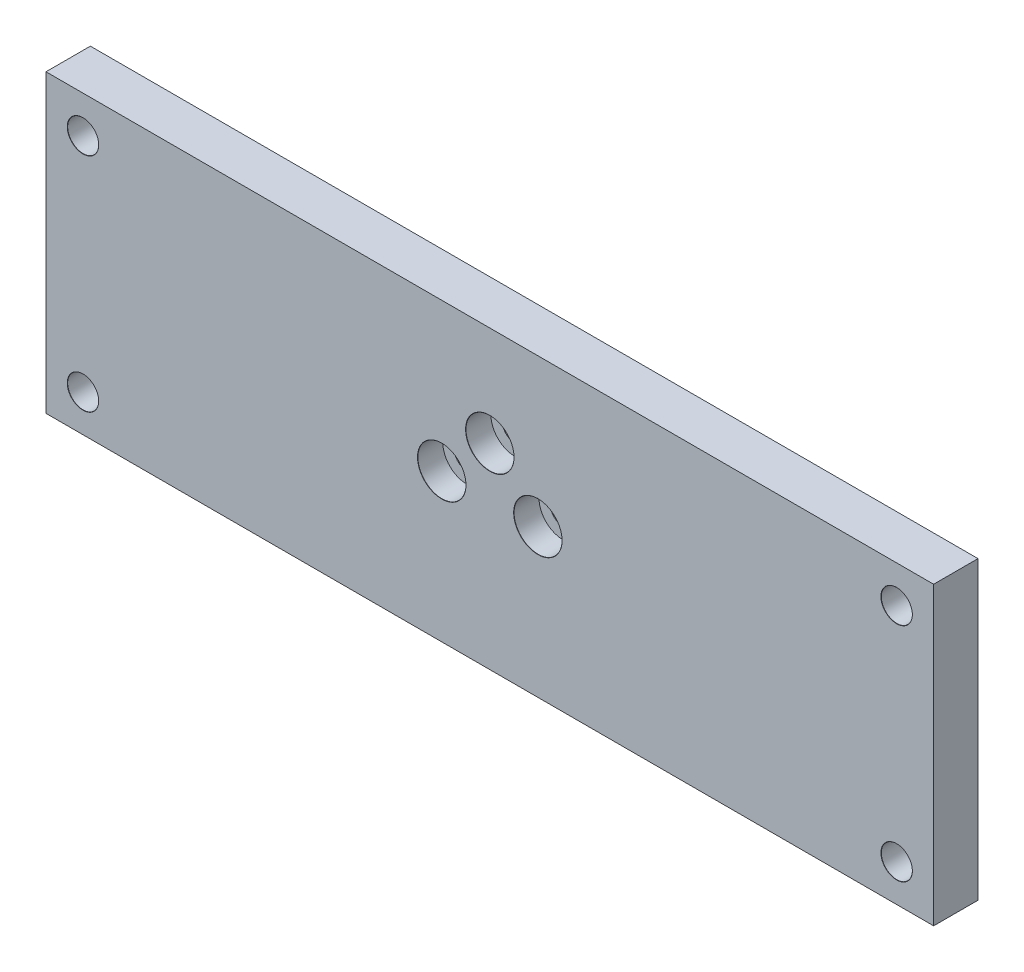
ISO-10303-21;
HEADER;
FILE_DESCRIPTION(('STEP AP214'),'2;1');
FILE_NAME('part.step','',(''),(''),'','','');
FILE_SCHEMA(('AUTOMOTIVE_DESIGN { 1 0 10303 214 1 1 1 1 }'));
ENDSEC;
DATA;
#1=APPLICATION_CONTEXT('core data for automotive mechanical design processes');
#2=APPLICATION_PROTOCOL_DEFINITION('international standard','automotive_design',2000,#1);
#3=PRODUCT_CONTEXT('',#1,'mechanical');
#4=PRODUCT('Part','Part','',(#3));
#5=PRODUCT_RELATED_PRODUCT_CATEGORY('part','',(#4));
#6=PRODUCT_DEFINITION_FORMATION('','',#4);
#7=PRODUCT_DEFINITION_CONTEXT('part definition',#1,'design');
#8=PRODUCT_DEFINITION('design','',#6,#7);
#9=PRODUCT_DEFINITION_SHAPE('','',#8);
#10=(LENGTH_UNIT() NAMED_UNIT(*) SI_UNIT(.MILLI.,.METRE.));
#11=(NAMED_UNIT(*) PLANE_ANGLE_UNIT() SI_UNIT($,.RADIAN.));
#12=(NAMED_UNIT(*) SI_UNIT($,.STERADIAN.) SOLID_ANGLE_UNIT());
#13=UNCERTAINTY_MEASURE_WITH_UNIT(LENGTH_MEASURE(1.E-05),#10,'distance_accuracy_value','');
#14=(GEOMETRIC_REPRESENTATION_CONTEXT(3) GLOBAL_UNCERTAINTY_ASSIGNED_CONTEXT((#13)) GLOBAL_UNIT_ASSIGNED_CONTEXT((#10,
#11,#12)) REPRESENTATION_CONTEXT('',''));
#15=CARTESIAN_POINT('',(0.,0.,0.));
#16=DIRECTION('',(0.,0.,1.));
#17=DIRECTION('',(1.,0.,0.));
#18=AXIS2_PLACEMENT_3D('',#15,#16,#17);
#19=CARTESIAN_POINT('',(0.,0.,6.));
#20=DIRECTION('',(0.,0.,1.));
#21=DIRECTION('',(1.,0.,0.));
#22=AXIS2_PLACEMENT_3D('',#19,#20,#21);
#23=PLANE('',#22);
#24=CARTESIAN_POINT('',(55.,15.,6.));
#25=DIRECTION('',(0.,0.,1.));
#26=DIRECTION('',(1.,0.,0.));
#27=AXIS2_PLACEMENT_3D('',#24,#25,#26);
#28=CIRCLE('',#27,2.125);
#29=CARTESIAN_POINT('',(57.125,15.,6.));
#30=VERTEX_POINT('',#29);
#31=EDGE_CURVE('E300',#30,#30,#28,.T.);
#32=ORIENTED_EDGE('',*,*,#31,.F.);
#33=EDGE_LOOP('',(#32));
#34=FACE_BOUND('',#33,.T.);
#35=CARTESIAN_POINT('',(-55.,15.,6.));
#36=DIRECTION('',(0.,0.,1.));
#37=DIRECTION('',(1.,0.,0.));
#38=AXIS2_PLACEMENT_3D('',#35,#36,#37);
#39=CIRCLE('',#38,2.125);
#40=CARTESIAN_POINT('',(-52.875,15.,6.));
#41=VERTEX_POINT('',#40);
#42=EDGE_CURVE('E310',#41,#41,#39,.T.);
#43=ORIENTED_EDGE('',*,*,#42,.F.);
#44=EDGE_LOOP('',(#43));
#45=FACE_BOUND('',#44,.T.);
#46=CARTESIAN_POINT('',(-55.,-15.,6.));
#47=DIRECTION('',(0.,0.,1.));
#48=DIRECTION('',(1.,0.,0.));
#49=AXIS2_PLACEMENT_3D('',#46,#47,#48);
#50=CIRCLE('',#49,2.125);
#51=CARTESIAN_POINT('',(-52.875,-15.,6.));
#52=VERTEX_POINT('',#51);
#53=EDGE_CURVE('E322',#52,#52,#50,.T.);
#54=ORIENTED_EDGE('',*,*,#53,.F.);
#55=EDGE_LOOP('',(#54));
#56=FACE_BOUND('',#55,.T.);
#57=CARTESIAN_POINT('',(55.,-15.,6.));
#58=DIRECTION('',(0.,0.,1.));
#59=DIRECTION('',(1.,0.,0.));
#60=AXIS2_PLACEMENT_3D('',#57,#58,#59);
#61=CIRCLE('',#60,2.125);
#62=CARTESIAN_POINT('',(57.125,-15.,6.));
#63=VERTEX_POINT('',#62);
#64=EDGE_CURVE('E334',#63,#63,#61,.T.);
#65=ORIENTED_EDGE('',*,*,#64,.F.);
#66=EDGE_LOOP('',(#65));
#67=FACE_BOUND('',#66,.T.);
#68=CARTESIAN_POINT('',(0.,6.5,6.));
#69=DIRECTION('',(0.,0.,1.));
#70=DIRECTION('',(1.,0.,0.));
#71=AXIS2_PLACEMENT_3D('',#68,#69,#70);
#72=CIRCLE('',#71,3.275);
#73=CARTESIAN_POINT('',(3.275,6.5,6.));
#74=VERTEX_POINT('',#73);
#75=EDGE_CURVE('E130',#74,#74,#72,.T.);
#76=ORIENTED_EDGE('',*,*,#75,.F.);
#77=EDGE_LOOP('',(#76));
#78=FACE_BOUND('',#77,.T.);
#79=CARTESIAN_POINT('',(6.5,0.,6.));
#80=DIRECTION('',(0.,0.,1.));
#81=DIRECTION('',(1.,0.,0.));
#82=AXIS2_PLACEMENT_3D('',#79,#80,#81);
#83=CIRCLE('',#82,3.275);
#84=CARTESIAN_POINT('',(9.775,0.,6.));
#85=VERTEX_POINT('',#84);
#86=EDGE_CURVE('E151',#85,#85,#83,.T.);
#87=ORIENTED_EDGE('',*,*,#86,.F.);
#88=EDGE_LOOP('',(#87));
#89=FACE_BOUND('',#88,.T.);
#90=CARTESIAN_POINT('',(-6.5,0.,6.));
#91=DIRECTION('',(0.,0.,1.));
#92=DIRECTION('',(1.,0.,0.));
#93=AXIS2_PLACEMENT_3D('',#90,#91,#92);
#94=CIRCLE('',#93,3.275);
#95=CARTESIAN_POINT('',(-3.225,0.,6.));
#96=VERTEX_POINT('',#95);
#97=EDGE_CURVE('E171',#96,#96,#94,.T.);
#98=ORIENTED_EDGE('',*,*,#97,.F.);
#99=EDGE_LOOP('',(#98));
#100=FACE_BOUND('',#99,.T.);
#101=DIRECTION('',(0.,1.,0.));
#102=VECTOR('',#101,1.);
#103=CARTESIAN_POINT('',(60.,-20.,6.));
#104=LINE('',#103,#102);
#105=CARTESIAN_POINT('',(60.,-20.,6.));
#106=VERTEX_POINT('',#105);
#107=CARTESIAN_POINT('',(60.,20.,6.));
#108=VERTEX_POINT('',#107);
#109=EDGE_CURVE('E88',#106,#108,#104,.T.);
#110=ORIENTED_EDGE('',*,*,#109,.T.);
#111=DIRECTION('',(-1.,0.,0.));
#112=VECTOR('',#111,1.);
#113=CARTESIAN_POINT('',(-60.,20.,6.));
#114=LINE('',#113,#112);
#115=CARTESIAN_POINT('',(-60.,20.,6.));
#116=VERTEX_POINT('',#115);
#117=EDGE_CURVE('E97',#108,#116,#114,.T.);
#118=ORIENTED_EDGE('',*,*,#117,.T.);
#119=DIRECTION('',(0.,-1.,0.));
#120=VECTOR('',#119,1.);
#121=CARTESIAN_POINT('',(-60.,-20.,6.));
#122=LINE('',#121,#120);
#123=CARTESIAN_POINT('',(-60.,-20.,6.));
#124=VERTEX_POINT('',#123);
#125=EDGE_CURVE('E104',#116,#124,#122,.T.);
#126=ORIENTED_EDGE('',*,*,#125,.T.);
#127=DIRECTION('',(1.,0.,0.));
#128=VECTOR('',#127,1.);
#129=CARTESIAN_POINT('',(-60.,-20.,6.));
#130=LINE('',#129,#128);
#131=EDGE_CURVE('E94',#124,#106,#130,.T.);
#132=ORIENTED_EDGE('',*,*,#131,.T.);
#133=EDGE_LOOP('',(#110,#118,#126,#132));
#134=FACE_BOUND('',#133,.T.);
#135=ADVANCED_FACE('F45',(#34,#45,#56,#67,#78,#89,#100,#134),#23,.T.);
#136=CARTESIAN_POINT('',(0.,0.,0.));
#137=DIRECTION('',(0.,0.,1.));
#138=DIRECTION('',(1.,0.,0.));
#139=AXIS2_PLACEMENT_3D('',#136,#137,#138);
#140=PLANE('',#139);
#141=CARTESIAN_POINT('',(55.,15.,0.));
#142=DIRECTION('',(0.,0.,1.));
#143=DIRECTION('',(1.,0.,0.));
#144=AXIS2_PLACEMENT_3D('',#141,#142,#143);
#145=CIRCLE('',#144,2.1);
#146=CARTESIAN_POINT('',(57.1,15.,0.));
#147=VERTEX_POINT('',#146);
#148=EDGE_CURVE('E304',#147,#147,#145,.T.);
#149=ORIENTED_EDGE('',*,*,#148,.T.);
#150=EDGE_LOOP('',(#149));
#151=FACE_BOUND('',#150,.T.);
#152=CARTESIAN_POINT('',(-55.,15.,0.));
#153=DIRECTION('',(0.,0.,1.));
#154=DIRECTION('',(1.,0.,0.));
#155=AXIS2_PLACEMENT_3D('',#152,#153,#154);
#156=CIRCLE('',#155,2.1);
#157=CARTESIAN_POINT('',(-52.9,15.,0.));
#158=VERTEX_POINT('',#157);
#159=EDGE_CURVE('E318',#158,#158,#156,.T.);
#160=ORIENTED_EDGE('',*,*,#159,.T.);
#161=EDGE_LOOP('',(#160));
#162=FACE_BOUND('',#161,.T.);
#163=CARTESIAN_POINT('',(-55.,-15.,0.));
#164=DIRECTION('',(0.,0.,1.));
#165=DIRECTION('',(1.,0.,0.));
#166=AXIS2_PLACEMENT_3D('',#163,#164,#165);
#167=CIRCLE('',#166,2.1);
#168=CARTESIAN_POINT('',(-52.9,-15.,0.));
#169=VERTEX_POINT('',#168);
#170=EDGE_CURVE('E330',#169,#169,#167,.T.);
#171=ORIENTED_EDGE('',*,*,#170,.T.);
#172=EDGE_LOOP('',(#171));
#173=FACE_BOUND('',#172,.T.);
#174=CARTESIAN_POINT('',(55.,-15.,0.));
#175=DIRECTION('',(0.,0.,1.));
#176=DIRECTION('',(1.,0.,0.));
#177=AXIS2_PLACEMENT_3D('',#174,#175,#176);
#178=CIRCLE('',#177,2.1);
#179=CARTESIAN_POINT('',(57.1,-15.,0.));
#180=VERTEX_POINT('',#179);
#181=EDGE_CURVE('E108',#180,#180,#178,.T.);
#182=ORIENTED_EDGE('',*,*,#181,.T.);
#183=EDGE_LOOP('',(#182));
#184=FACE_BOUND('',#183,.T.);
#185=CARTESIAN_POINT('',(0.,6.5,0.));
#186=DIRECTION('',(0.,0.,1.));
#187=DIRECTION('',(1.,0.,0.));
#188=AXIS2_PLACEMENT_3D('',#185,#186,#187);
#189=CIRCLE('',#188,1.7);
#190=CARTESIAN_POINT('',(1.7,6.5,0.));
#191=VERTEX_POINT('',#190);
#192=EDGE_CURVE('E147',#191,#191,#189,.T.);
#193=ORIENTED_EDGE('',*,*,#192,.T.);
#194=EDGE_LOOP('',(#193));
#195=FACE_BOUND('',#194,.T.);
#196=CARTESIAN_POINT('',(6.5,0.,0.));
#197=DIRECTION('',(0.,0.,1.));
#198=DIRECTION('',(1.,0.,0.));
#199=AXIS2_PLACEMENT_3D('',#196,#197,#198);
#200=CIRCLE('',#199,1.7);
#201=CARTESIAN_POINT('',(8.2,0.,0.));
#202=VERTEX_POINT('',#201);
#203=EDGE_CURVE('E167',#202,#202,#200,.T.);
#204=ORIENTED_EDGE('',*,*,#203,.T.);
#205=EDGE_LOOP('',(#204));
#206=FACE_BOUND('',#205,.T.);
#207=CARTESIAN_POINT('',(-6.5,0.,0.));
#208=DIRECTION('',(0.,0.,1.));
#209=DIRECTION('',(1.,0.,0.));
#210=AXIS2_PLACEMENT_3D('',#207,#208,#209);
#211=CIRCLE('',#210,1.7);
#212=CARTESIAN_POINT('',(-4.8,0.,0.));
#213=VERTEX_POINT('',#212);
#214=EDGE_CURVE('E11',#213,#213,#211,.T.);
#215=ORIENTED_EDGE('',*,*,#214,.T.);
#216=EDGE_LOOP('',(#215));
#217=FACE_BOUND('',#216,.T.);
#218=DIRECTION('',(0.,-1.,0.));
#219=VECTOR('',#218,1.);
#220=CARTESIAN_POINT('',(60.,-20.,0.));
#221=LINE('',#220,#219);
#222=CARTESIAN_POINT('',(60.,20.,0.));
#223=VERTEX_POINT('',#222);
#224=CARTESIAN_POINT('',(60.,-20.,0.));
#225=VERTEX_POINT('',#224);
#226=EDGE_CURVE('E63',#223,#225,#221,.T.);
#227=ORIENTED_EDGE('',*,*,#226,.T.);
#228=DIRECTION('',(-1.,0.,0.));
#229=VECTOR('',#228,1.);
#230=CARTESIAN_POINT('',(-60.,-20.,0.));
#231=LINE('',#230,#229);
#232=CARTESIAN_POINT('',(-60.,-20.,0.));
#233=VERTEX_POINT('',#232);
#234=EDGE_CURVE('E344',#225,#233,#231,.T.);
#235=ORIENTED_EDGE('',*,*,#234,.T.);
#236=DIRECTION('',(0.,1.,0.));
#237=VECTOR('',#236,1.);
#238=CARTESIAN_POINT('',(-60.,-20.,0.));
#239=LINE('',#238,#237);
#240=CARTESIAN_POINT('',(-60.,20.,0.));
#241=VERTEX_POINT('',#240);
#242=EDGE_CURVE('E124',#233,#241,#239,.T.);
#243=ORIENTED_EDGE('',*,*,#242,.T.);
#244=DIRECTION('',(1.,0.,0.));
#245=VECTOR('',#244,1.);
#246=CARTESIAN_POINT('',(-60.,20.,0.));
#247=LINE('',#246,#245);
#248=EDGE_CURVE('E135',#241,#223,#247,.T.);
#249=ORIENTED_EDGE('',*,*,#248,.T.);
#250=EDGE_LOOP('',(#227,#235,#243,#249));
#251=FACE_BOUND('',#250,.T.);
#252=ADVANCED_FACE('F47',(#151,#162,#173,#184,#195,#206,#217,#251),#140,.F.);
#253=CARTESIAN_POINT('',(-6.5,0.,6.));
#254=DIRECTION('',(0.,0.,1.));
#255=DIRECTION('',(1.,0.,0.));
#256=AXIS2_PLACEMENT_3D('',#253,#254,#255);
#257=CYLINDRICAL_SURFACE('',#256,1.7);
#258=ORIENTED_EDGE('',*,*,#214,.F.);
#259=EDGE_LOOP('',(#258));
#260=FACE_BOUND('',#259,.T.);
#261=CARTESIAN_POINT('',(-6.5,0.,2.6));
#262=DIRECTION('',(0.,0.,1.));
#263=DIRECTION('',(1.,0.,0.));
#264=AXIS2_PLACEMENT_3D('',#261,#262,#263);
#265=CIRCLE('',#264,1.7);
#266=CARTESIAN_POINT('',(-4.8,0.,2.6));
#267=VERTEX_POINT('',#266);
#268=EDGE_CURVE('E55',#267,#267,#265,.T.);
#269=ORIENTED_EDGE('',*,*,#268,.T.);
#270=EDGE_LOOP('',(#269));
#271=FACE_BOUND('',#270,.T.);
#272=ADVANCED_FACE('F186',(#260,#271),#257,.F.);
#273=CARTESIAN_POINT('',(-3.25,0.,2.6));
#274=DIRECTION('',(0.,0.,-1.));
#275=DIRECTION('',(-1.,0.,0.));
#276=AXIS2_PLACEMENT_3D('',#273,#274,#275);
#277=PLANE('',#276);
#278=ORIENTED_EDGE('',*,*,#268,.F.);
#279=EDGE_LOOP('',(#278));
#280=FACE_BOUND('',#279,.T.);
#281=CARTESIAN_POINT('',(-6.5,0.,2.6));
#282=DIRECTION('',(0.,0.,1.));
#283=DIRECTION('',(1.,0.,0.));
#284=AXIS2_PLACEMENT_3D('',#281,#282,#283);
#285=CIRCLE('',#284,3.25);
#286=CARTESIAN_POINT('',(-3.25,0.,2.6));
#287=VERTEX_POINT('',#286);
#288=EDGE_CURVE('E179',#287,#287,#285,.T.);
#289=ORIENTED_EDGE('',*,*,#288,.T.);
#290=EDGE_LOOP('',(#289));
#291=FACE_BOUND('',#290,.T.);
#292=ADVANCED_FACE('F188',(#280,#291),#277,.F.);
#293=CARTESIAN_POINT('',(-6.5,0.,6.));
#294=DIRECTION('',(0.,0.,1.));
#295=DIRECTION('',(1.,0.,0.));
#296=AXIS2_PLACEMENT_3D('',#293,#294,#295);
#297=CYLINDRICAL_SURFACE('',#296,3.25);
#298=ORIENTED_EDGE('',*,*,#288,.F.);
#299=EDGE_LOOP('',(#298));
#300=FACE_BOUND('',#299,.T.);
#301=CARTESIAN_POINT('',(-6.5,0.,5.975));
#302=DIRECTION('',(0.,0.,1.));
#303=DIRECTION('',(1.,0.,0.));
#304=AXIS2_PLACEMENT_3D('',#301,#302,#303);
#305=CIRCLE('',#304,3.25);
#306=CARTESIAN_POINT('',(-3.25,0.,5.975));
#307=VERTEX_POINT('',#306);
#308=EDGE_CURVE('E175',#307,#307,#305,.T.);
#309=ORIENTED_EDGE('',*,*,#308,.T.);
#310=EDGE_LOOP('',(#309));
#311=FACE_BOUND('',#310,.T.);
#312=ADVANCED_FACE('F191',(#300,#311),#297,.F.);
#313=CARTESIAN_POINT('',(-6.5,0.,6.));
#314=DIRECTION('',(0.,0.,1.));
#315=DIRECTION('',(1.,0.,0.));
#316=AXIS2_PLACEMENT_3D('',#313,#314,#315);
#317=CONICAL_SURFACE('',#316,3.275,0.785398163397466);
#318=ORIENTED_EDGE('',*,*,#308,.F.);
#319=EDGE_LOOP('',(#318));
#320=FACE_BOUND('',#319,.T.);
#321=ORIENTED_EDGE('',*,*,#97,.T.);
#322=EDGE_LOOP('',(#321));
#323=FACE_BOUND('',#322,.T.);
#324=ADVANCED_FACE('F197',(#320,#323),#317,.F.);
#325=CARTESIAN_POINT('',(6.5,0.,6.));
#326=DIRECTION('',(0.,0.,1.));
#327=DIRECTION('',(1.,0.,0.));
#328=AXIS2_PLACEMENT_3D('',#325,#326,#327);
#329=CYLINDRICAL_SURFACE('',#328,1.7);
#330=ORIENTED_EDGE('',*,*,#203,.F.);
#331=EDGE_LOOP('',(#330));
#332=FACE_BOUND('',#331,.T.);
#333=CARTESIAN_POINT('',(6.5,0.,2.6));
#334=DIRECTION('',(0.,0.,1.));
#335=DIRECTION('',(1.,0.,0.));
#336=AXIS2_PLACEMENT_3D('',#333,#334,#335);
#337=CIRCLE('',#336,1.7);
#338=CARTESIAN_POINT('',(8.2,0.,2.6));
#339=VERTEX_POINT('',#338);
#340=EDGE_CURVE('E163',#339,#339,#337,.T.);
#341=ORIENTED_EDGE('',*,*,#340,.T.);
#342=EDGE_LOOP('',(#341));
#343=FACE_BOUND('',#342,.T.);
#344=ADVANCED_FACE('F203',(#332,#343),#329,.F.);
#345=CARTESIAN_POINT('',(9.75,0.,2.6));
#346=DIRECTION('',(0.,0.,-1.));
#347=DIRECTION('',(-1.,0.,0.));
#348=AXIS2_PLACEMENT_3D('',#345,#346,#347);
#349=PLANE('',#348);
#350=ORIENTED_EDGE('',*,*,#340,.F.);
#351=EDGE_LOOP('',(#350));
#352=FACE_BOUND('',#351,.T.);
#353=CARTESIAN_POINT('',(6.5,0.,2.6));
#354=DIRECTION('',(0.,0.,1.));
#355=DIRECTION('',(1.,0.,0.));
#356=AXIS2_PLACEMENT_3D('',#353,#354,#355);
#357=CIRCLE('',#356,3.25);
#358=CARTESIAN_POINT('',(9.75,0.,2.6));
#359=VERTEX_POINT('',#358);
#360=EDGE_CURVE('E159',#359,#359,#357,.T.);
#361=ORIENTED_EDGE('',*,*,#360,.T.);
#362=EDGE_LOOP('',(#361));
#363=FACE_BOUND('',#362,.T.);
#364=ADVANCED_FACE('F222',(#352,#363),#349,.F.);
#365=CARTESIAN_POINT('',(6.5,0.,6.));
#366=DIRECTION('',(0.,0.,1.));
#367=DIRECTION('',(1.,0.,0.));
#368=AXIS2_PLACEMENT_3D('',#365,#366,#367);
#369=CYLINDRICAL_SURFACE('',#368,3.25);
#370=ORIENTED_EDGE('',*,*,#360,.F.);
#371=EDGE_LOOP('',(#370));
#372=FACE_BOUND('',#371,.T.);
#373=CARTESIAN_POINT('',(6.5,0.,5.975));
#374=DIRECTION('',(0.,0.,1.));
#375=DIRECTION('',(1.,0.,0.));
#376=AXIS2_PLACEMENT_3D('',#373,#374,#375);
#377=CIRCLE('',#376,3.25);
#378=CARTESIAN_POINT('',(9.75,0.,5.975));
#379=VERTEX_POINT('',#378);
#380=EDGE_CURVE('E155',#379,#379,#377,.T.);
#381=ORIENTED_EDGE('',*,*,#380,.T.);
#382=EDGE_LOOP('',(#381));
#383=FACE_BOUND('',#382,.T.);
#384=ADVANCED_FACE('F226',(#372,#383),#369,.F.);
#385=CARTESIAN_POINT('',(6.5,0.,6.));
#386=DIRECTION('',(0.,0.,1.));
#387=DIRECTION('',(1.,0.,0.));
#388=AXIS2_PLACEMENT_3D('',#385,#386,#387);
#389=CONICAL_SURFACE('',#388,3.275,0.785398163397466);
#390=ORIENTED_EDGE('',*,*,#380,.F.);
#391=EDGE_LOOP('',(#390));
#392=FACE_BOUND('',#391,.T.);
#393=ORIENTED_EDGE('',*,*,#86,.T.);
#394=EDGE_LOOP('',(#393));
#395=FACE_BOUND('',#394,.T.);
#396=ADVANCED_FACE('F230',(#392,#395),#389,.F.);
#397=CARTESIAN_POINT('',(0.,6.5,6.));
#398=DIRECTION('',(0.,0.,1.));
#399=DIRECTION('',(1.,0.,0.));
#400=AXIS2_PLACEMENT_3D('',#397,#398,#399);
#401=CYLINDRICAL_SURFACE('',#400,1.7);
#402=ORIENTED_EDGE('',*,*,#192,.F.);
#403=EDGE_LOOP('',(#402));
#404=FACE_BOUND('',#403,.T.);
#405=CARTESIAN_POINT('',(0.,6.5,2.6));
#406=DIRECTION('',(0.,0.,1.));
#407=DIRECTION('',(1.,0.,0.));
#408=AXIS2_PLACEMENT_3D('',#405,#406,#407);
#409=CIRCLE('',#408,1.7);
#410=CARTESIAN_POINT('',(1.7,6.5,2.6));
#411=VERTEX_POINT('',#410);
#412=EDGE_CURVE('E143',#411,#411,#409,.T.);
#413=ORIENTED_EDGE('',*,*,#412,.T.);
#414=EDGE_LOOP('',(#413));
#415=FACE_BOUND('',#414,.T.);
#416=ADVANCED_FACE('F234',(#404,#415),#401,.F.);
#417=CARTESIAN_POINT('',(3.25,6.5,2.6));
#418=DIRECTION('',(0.,0.,-1.));
#419=DIRECTION('',(-1.,0.,0.));
#420=AXIS2_PLACEMENT_3D('',#417,#418,#419);
#421=PLANE('',#420);
#422=ORIENTED_EDGE('',*,*,#412,.F.);
#423=EDGE_LOOP('',(#422));
#424=FACE_BOUND('',#423,.T.);
#425=CARTESIAN_POINT('',(0.,6.5,2.6));
#426=DIRECTION('',(0.,0.,1.));
#427=DIRECTION('',(1.,0.,0.));
#428=AXIS2_PLACEMENT_3D('',#425,#426,#427);
#429=CIRCLE('',#428,3.25);
#430=CARTESIAN_POINT('',(3.25,6.5,2.6));
#431=VERTEX_POINT('',#430);
#432=EDGE_CURVE('E139',#431,#431,#429,.T.);
#433=ORIENTED_EDGE('',*,*,#432,.T.);
#434=EDGE_LOOP('',(#433));
#435=FACE_BOUND('',#434,.T.);
#436=ADVANCED_FACE('F238',(#424,#435),#421,.F.);
#437=CARTESIAN_POINT('',(0.,6.5,6.));
#438=DIRECTION('',(0.,0.,1.));
#439=DIRECTION('',(1.,0.,0.));
#440=AXIS2_PLACEMENT_3D('',#437,#438,#439);
#441=CYLINDRICAL_SURFACE('',#440,3.25);
#442=ORIENTED_EDGE('',*,*,#432,.F.);
#443=EDGE_LOOP('',(#442));
#444=FACE_BOUND('',#443,.T.);
#445=CARTESIAN_POINT('',(0.,6.5,5.975));
#446=DIRECTION('',(0.,0.,1.));
#447=DIRECTION('',(1.,0.,0.));
#448=AXIS2_PLACEMENT_3D('',#445,#446,#447);
#449=CIRCLE('',#448,3.25);
#450=CARTESIAN_POINT('',(3.25,6.5,5.975));
#451=VERTEX_POINT('',#450);
#452=EDGE_CURVE('E134',#451,#451,#449,.T.);
#453=ORIENTED_EDGE('',*,*,#452,.T.);
#454=EDGE_LOOP('',(#453));
#455=FACE_BOUND('',#454,.T.);
#456=ADVANCED_FACE('F242',(#444,#455),#441,.F.);
#457=CARTESIAN_POINT('',(0.,6.5,6.));
#458=DIRECTION('',(0.,0.,1.));
#459=DIRECTION('',(1.,0.,0.));
#460=AXIS2_PLACEMENT_3D('',#457,#458,#459);
#461=CONICAL_SURFACE('',#460,3.275,0.785398163397466);
#462=ORIENTED_EDGE('',*,*,#452,.F.);
#463=EDGE_LOOP('',(#462));
#464=FACE_BOUND('',#463,.T.);
#465=ORIENTED_EDGE('',*,*,#75,.T.);
#466=EDGE_LOOP('',(#465));
#467=FACE_BOUND('',#466,.T.);
#468=ADVANCED_FACE('F246',(#464,#467),#461,.F.);
#469=CARTESIAN_POINT('',(-60.,20.,-126.491106406735));
#470=DIRECTION('',(0.,1.,0.));
#471=DIRECTION('',(0.,0.,1.));
#472=AXIS2_PLACEMENT_3D('',#469,#470,#471);
#473=PLANE('',#472);
#474=ORIENTED_EDGE('',*,*,#248,.F.);
#475=DIRECTION('',(0.,0.,1.));
#476=VECTOR('',#475,1.);
#477=CARTESIAN_POINT('',(-60.,20.,-126.491106406735));
#478=LINE('',#477,#476);
#479=EDGE_CURVE('E93',#241,#116,#478,.T.);
#480=ORIENTED_EDGE('',*,*,#479,.T.);
#481=ORIENTED_EDGE('',*,*,#117,.F.);
#482=DIRECTION('',(0.,0.,1.));
#483=VECTOR('',#482,1.);
#484=CARTESIAN_POINT('',(60.,20.,-126.491106406735));
#485=LINE('',#484,#483);
#486=EDGE_CURVE('E83',#223,#108,#485,.T.);
#487=ORIENTED_EDGE('',*,*,#486,.F.);
#488=EDGE_LOOP('',(#474,#480,#481,#487));
#489=FACE_BOUND('',#488,.T.);
#490=ADVANCED_FACE('F98',(#489),#473,.T.);
#491=CARTESIAN_POINT('',(-60.,-20.,-126.491106406735));
#492=DIRECTION('',(-1.,0.,0.));
#493=DIRECTION('',(0.,0.,1.));
#494=AXIS2_PLACEMENT_3D('',#491,#492,#493);
#495=PLANE('',#494);
#496=ORIENTED_EDGE('',*,*,#242,.F.);
#497=DIRECTION('',(0.,0.,1.));
#498=VECTOR('',#497,1.);
#499=CARTESIAN_POINT('',(-60.,-20.,-126.491106406735));
#500=LINE('',#499,#498);
#501=EDGE_CURVE('E125',#233,#124,#500,.T.);
#502=ORIENTED_EDGE('',*,*,#501,.T.);
#503=ORIENTED_EDGE('',*,*,#125,.F.);
#504=ORIENTED_EDGE('',*,*,#479,.F.);
#505=EDGE_LOOP('',(#496,#502,#503,#504));
#506=FACE_BOUND('',#505,.T.);
#507=ADVANCED_FACE('F256',(#506),#495,.T.);
#508=CARTESIAN_POINT('',(-60.,-20.,-126.491106406735));
#509=DIRECTION('',(0.,-1.,0.));
#510=DIRECTION('',(0.,0.,-1.));
#511=AXIS2_PLACEMENT_3D('',#508,#509,#510);
#512=PLANE('',#511);
#513=ORIENTED_EDGE('',*,*,#234,.F.);
#514=DIRECTION('',(0.,0.,1.));
#515=VECTOR('',#514,1.);
#516=CARTESIAN_POINT('',(60.,-20.,-126.491106406735));
#517=LINE('',#516,#515);
#518=EDGE_CURVE('E121',#225,#106,#517,.T.);
#519=ORIENTED_EDGE('',*,*,#518,.T.);
#520=ORIENTED_EDGE('',*,*,#131,.F.);
#521=ORIENTED_EDGE('',*,*,#501,.F.);
#522=EDGE_LOOP('',(#513,#519,#520,#521));
#523=FACE_BOUND('',#522,.T.);
#524=ADVANCED_FACE('F253',(#523),#512,.T.);
#525=CARTESIAN_POINT('',(60.,-20.,-126.491106406735));
#526=DIRECTION('',(1.,0.,0.));
#527=DIRECTION('',(0.,0.,-1.));
#528=AXIS2_PLACEMENT_3D('',#525,#526,#527);
#529=PLANE('',#528);
#530=ORIENTED_EDGE('',*,*,#226,.F.);
#531=ORIENTED_EDGE('',*,*,#486,.T.);
#532=ORIENTED_EDGE('',*,*,#109,.F.);
#533=ORIENTED_EDGE('',*,*,#518,.F.);
#534=EDGE_LOOP('',(#530,#531,#532,#533));
#535=FACE_BOUND('',#534,.T.);
#536=ADVANCED_FACE('F85',(#535),#529,.T.);
#537=CARTESIAN_POINT('',(55.,-15.,6.));
#538=DIRECTION('',(0.,0.,1.));
#539=DIRECTION('',(1.,0.,0.));
#540=AXIS2_PLACEMENT_3D('',#537,#538,#539);
#541=CYLINDRICAL_SURFACE('',#540,2.1);
#542=ORIENTED_EDGE('',*,*,#181,.F.);
#543=EDGE_LOOP('',(#542));
#544=FACE_BOUND('',#543,.T.);
#545=CARTESIAN_POINT('',(55.,-15.,5.975));
#546=DIRECTION('',(0.,0.,1.));
#547=DIRECTION('',(1.,0.,0.));
#548=AXIS2_PLACEMENT_3D('',#545,#546,#547);
#549=CIRCLE('',#548,2.1);
#550=CARTESIAN_POINT('',(57.1,-15.,5.975));
#551=VERTEX_POINT('',#550);
#552=EDGE_CURVE('E112',#551,#551,#549,.T.);
#553=ORIENTED_EDGE('',*,*,#552,.T.);
#554=EDGE_LOOP('',(#553));
#555=FACE_BOUND('',#554,.T.);
#556=ADVANCED_FACE('F252',(#544,#555),#541,.F.);
#557=CARTESIAN_POINT('',(55.,-15.,6.));
#558=DIRECTION('',(0.,0.,1.));
#559=DIRECTION('',(1.,0.,0.));
#560=AXIS2_PLACEMENT_3D('',#557,#558,#559);
#561=CONICAL_SURFACE('',#560,2.125,0.785398163397483);
#562=ORIENTED_EDGE('',*,*,#552,.F.);
#563=EDGE_LOOP('',(#562));
#564=FACE_BOUND('',#563,.T.);
#565=ORIENTED_EDGE('',*,*,#64,.T.);
#566=EDGE_LOOP('',(#565));
#567=FACE_BOUND('',#566,.T.);
#568=ADVANCED_FACE('F265',(#564,#567),#561,.F.);
#569=CARTESIAN_POINT('',(-55.,-15.,6.));
#570=DIRECTION('',(0.,0.,1.));
#571=DIRECTION('',(1.,0.,0.));
#572=AXIS2_PLACEMENT_3D('',#569,#570,#571);
#573=CYLINDRICAL_SURFACE('',#572,2.1);
#574=ORIENTED_EDGE('',*,*,#170,.F.);
#575=EDGE_LOOP('',(#574));
#576=FACE_BOUND('',#575,.T.);
#577=CARTESIAN_POINT('',(-55.,-15.,5.975));
#578=DIRECTION('',(0.,0.,1.));
#579=DIRECTION('',(1.,0.,0.));
#580=AXIS2_PLACEMENT_3D('',#577,#578,#579);
#581=CIRCLE('',#580,2.1);
#582=CARTESIAN_POINT('',(-52.9,-15.,5.975));
#583=VERTEX_POINT('',#582);
#584=EDGE_CURVE('E326',#583,#583,#581,.T.);
#585=ORIENTED_EDGE('',*,*,#584,.T.);
#586=EDGE_LOOP('',(#585));
#587=FACE_BOUND('',#586,.T.);
#588=ADVANCED_FACE('F269',(#576,#587),#573,.F.);
#589=CARTESIAN_POINT('',(-55.,-15.,6.));
#590=DIRECTION('',(0.,0.,1.));
#591=DIRECTION('',(1.,0.,0.));
#592=AXIS2_PLACEMENT_3D('',#589,#590,#591);
#593=CONICAL_SURFACE('',#592,2.125,0.785398163397483);
#594=ORIENTED_EDGE('',*,*,#584,.F.);
#595=EDGE_LOOP('',(#594));
#596=FACE_BOUND('',#595,.T.);
#597=ORIENTED_EDGE('',*,*,#53,.T.);
#598=EDGE_LOOP('',(#597));
#599=FACE_BOUND('',#598,.T.);
#600=ADVANCED_FACE('F273',(#596,#599),#593,.F.);
#601=CARTESIAN_POINT('',(-55.,15.,6.));
#602=DIRECTION('',(0.,0.,1.));
#603=DIRECTION('',(1.,0.,0.));
#604=AXIS2_PLACEMENT_3D('',#601,#602,#603);
#605=CYLINDRICAL_SURFACE('',#604,2.1);
#606=ORIENTED_EDGE('',*,*,#159,.F.);
#607=EDGE_LOOP('',(#606));
#608=FACE_BOUND('',#607,.T.);
#609=CARTESIAN_POINT('',(-55.,15.,5.975));
#610=DIRECTION('',(0.,0.,1.));
#611=DIRECTION('',(1.,0.,0.));
#612=AXIS2_PLACEMENT_3D('',#609,#610,#611);
#613=CIRCLE('',#612,2.1);
#614=CARTESIAN_POINT('',(-52.9,15.,5.975));
#615=VERTEX_POINT('',#614);
#616=EDGE_CURVE('E314',#615,#615,#613,.T.);
#617=ORIENTED_EDGE('',*,*,#616,.T.);
#618=EDGE_LOOP('',(#617));
#619=FACE_BOUND('',#618,.T.);
#620=ADVANCED_FACE('F277',(#608,#619),#605,.F.);
#621=CARTESIAN_POINT('',(-55.,15.,6.));
#622=DIRECTION('',(0.,0.,1.));
#623=DIRECTION('',(1.,0.,0.));
#624=AXIS2_PLACEMENT_3D('',#621,#622,#623);
#625=CONICAL_SURFACE('',#624,2.125,0.785398163397483);
#626=ORIENTED_EDGE('',*,*,#616,.F.);
#627=EDGE_LOOP('',(#626));
#628=FACE_BOUND('',#627,.T.);
#629=ORIENTED_EDGE('',*,*,#42,.T.);
#630=EDGE_LOOP('',(#629));
#631=FACE_BOUND('',#630,.T.);
#632=ADVANCED_FACE('F281',(#628,#631),#625,.F.);
#633=CARTESIAN_POINT('',(55.,15.,6.));
#634=DIRECTION('',(0.,0.,1.));
#635=DIRECTION('',(1.,0.,0.));
#636=AXIS2_PLACEMENT_3D('',#633,#634,#635);
#637=CYLINDRICAL_SURFACE('',#636,2.1);
#638=ORIENTED_EDGE('',*,*,#148,.F.);
#639=EDGE_LOOP('',(#638));
#640=FACE_BOUND('',#639,.T.);
#641=CARTESIAN_POINT('',(55.,15.,5.975));
#642=DIRECTION('',(0.,0.,1.));
#643=DIRECTION('',(1.,0.,0.));
#644=AXIS2_PLACEMENT_3D('',#641,#642,#643);
#645=CIRCLE('',#644,2.1);
#646=CARTESIAN_POINT('',(57.1,15.,5.975));
#647=VERTEX_POINT('',#646);
#648=EDGE_CURVE('E298',#647,#647,#645,.T.);
#649=ORIENTED_EDGE('',*,*,#648,.T.);
#650=EDGE_LOOP('',(#649));
#651=FACE_BOUND('',#650,.T.);
#652=ADVANCED_FACE('F285',(#640,#651),#637,.F.);
#653=CARTESIAN_POINT('',(55.,15.,6.));
#654=DIRECTION('',(0.,0.,1.));
#655=DIRECTION('',(1.,0.,0.));
#656=AXIS2_PLACEMENT_3D('',#653,#654,#655);
#657=CONICAL_SURFACE('',#656,2.125,0.785398163397483);
#658=ORIENTED_EDGE('',*,*,#648,.F.);
#659=EDGE_LOOP('',(#658));
#660=FACE_BOUND('',#659,.T.);
#661=ORIENTED_EDGE('',*,*,#31,.T.);
#662=EDGE_LOOP('',(#661));
#663=FACE_BOUND('',#662,.T.);
#664=ADVANCED_FACE('F289',(#660,#663),#657,.F.);
#665=CLOSED_SHELL('',(#135,#252,#272,#292,#312,#324,#344,#364,#384,#396,#416,#436,#456,#468,
#490,#507,#524,#536,#556,#568,#588,#600,#620,#632,#652,#664));
#666=MANIFOLD_SOLID_BREP('B2',#665);
#667=ADVANCED_BREP_SHAPE_REPRESENTATION('',(#18,#666),#14);
#668=SHAPE_DEFINITION_REPRESENTATION(#9,#667);
ENDSEC;
END-ISO-10303-21;
